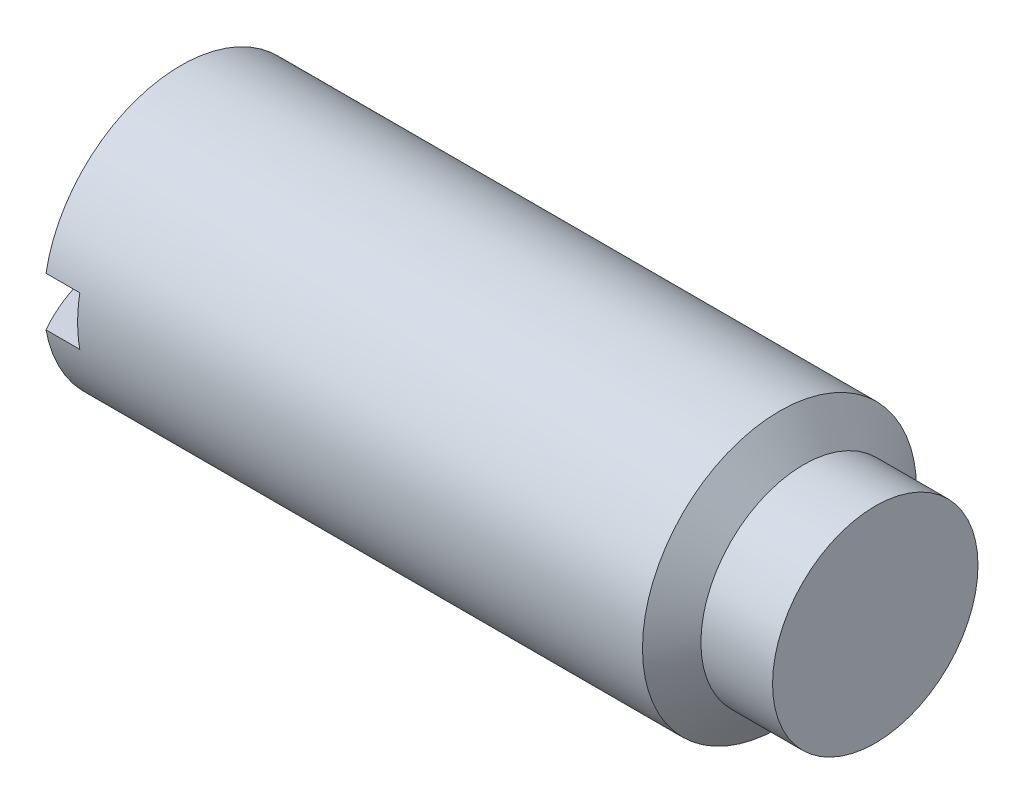
ISO-10303-21;
HEADER;
FILE_DESCRIPTION(('STEP AP214'),'2;1');
FILE_NAME('part.step','',(''),(''),'','','');
FILE_SCHEMA(('AUTOMOTIVE_DESIGN { 1 0 10303 214 1 1 1 1 }'));
ENDSEC;
DATA;
#1=APPLICATION_CONTEXT('core data for automotive mechanical design processes');
#2=APPLICATION_PROTOCOL_DEFINITION('international standard','automotive_design',2000,#1);
#3=PRODUCT_CONTEXT('',#1,'mechanical');
#4=PRODUCT('Part','Part','',(#3));
#5=PRODUCT_RELATED_PRODUCT_CATEGORY('part','',(#4));
#6=PRODUCT_DEFINITION_FORMATION('','',#4);
#7=PRODUCT_DEFINITION_CONTEXT('part definition',#1,'design');
#8=PRODUCT_DEFINITION('design','',#6,#7);
#9=PRODUCT_DEFINITION_SHAPE('','',#8);
#10=(LENGTH_UNIT() NAMED_UNIT(*) SI_UNIT(.MILLI.,.METRE.));
#11=(NAMED_UNIT(*) PLANE_ANGLE_UNIT() SI_UNIT($,.RADIAN.));
#12=(NAMED_UNIT(*) SI_UNIT($,.STERADIAN.) SOLID_ANGLE_UNIT());
#13=UNCERTAINTY_MEASURE_WITH_UNIT(LENGTH_MEASURE(1.E-05),#10,'distance_accuracy_value','');
#14=(GEOMETRIC_REPRESENTATION_CONTEXT(3) GLOBAL_UNCERTAINTY_ASSIGNED_CONTEXT((#13)) GLOBAL_UNIT_ASSIGNED_CONTEXT((#10,
#11,#12)) REPRESENTATION_CONTEXT('',''));
#15=CARTESIAN_POINT('',(0.,0.,0.));
#16=DIRECTION('',(0.,0.,1.));
#17=DIRECTION('',(1.,0.,0.));
#18=AXIS2_PLACEMENT_3D('',#15,#16,#17);
#19=CARTESIAN_POINT('',(19.05,0.,0.));
#20=DIRECTION('',(-1.,0.,0.));
#21=DIRECTION('',(0.,1.,0.));
#22=AXIS2_PLACEMENT_3D('',#19,#20,#21);
#23=SPHERICAL_SURFACE('',#22,19.05);
#24=CARTESIAN_POINT('',(19.05,1.7018,0.));
#25=DIRECTION('',(0.,-1.,0.));
#26=DIRECTION('',(0.,0.,-1.));
#27=AXIS2_PLACEMENT_3D('',#24,#25,#26);
#28=CIRCLE('',#27,18.9738340026469);
#29=CARTESIAN_POINT('',(2.55221605790645,1.7018,9.37173952689681));
#30=VERTEX_POINT('',#29);
#31=CARTESIAN_POINT('',(2.55221605790645,1.7018,-9.37173952689681));
#32=VERTEX_POINT('',#31);
#33=EDGE_CURVE('E94',#30,#32,#28,.T.);
#34=ORIENTED_EDGE('',*,*,#33,.F.);
#35=CARTESIAN_POINT('',(2.55221605790645,0.,0.));
#36=DIRECTION('',(-1.,0.,0.));
#37=DIRECTION('',(0.,0.,1.));
#38=AXIS2_PLACEMENT_3D('',#35,#36,#37);
#39=CIRCLE('',#38,9.525);
#40=EDGE_CURVE('E85',#30,#32,#39,.T.);
#41=ORIENTED_EDGE('',*,*,#40,.T.);
#42=EDGE_LOOP('',(#34,#41));
#43=FACE_BOUND('',#42,.T.);
#44=ADVANCED_FACE('F32',(#43),#23,.T.);
#45=CARTESIAN_POINT('',(19.05,-1.7018,0.));
#46=DIRECTION('',(0.,1.,0.));
#47=DIRECTION('',(0.,0.,1.));
#48=AXIS2_PLACEMENT_3D('',#45,#46,#47);
#49=CIRCLE('',#48,18.9738340026469);
#50=CARTESIAN_POINT('',(2.55221605790645,-1.7018,-9.37173952689681));
#51=VERTEX_POINT('',#50);
#52=CARTESIAN_POINT('',(2.55221605790645,-1.7018,9.37173952689681));
#53=VERTEX_POINT('',#52);
#54=EDGE_CURVE('E111',#51,#53,#49,.T.);
#55=ORIENTED_EDGE('',*,*,#54,.F.);
#56=EDGE_CURVE('E88',#51,#53,#39,.T.);
#57=ORIENTED_EDGE('',*,*,#56,.T.);
#58=EDGE_LOOP('',(#55,#57));
#59=FACE_BOUND('',#58,.T.);
#60=ADVANCED_FACE('F110',(#59),#23,.T.);
#61=CARTESIAN_POINT('',(-12.7,0.,0.));
#62=DIRECTION('',(-1.,0.,0.));
#63=DIRECTION('',(0.,0.,1.));
#64=AXIS2_PLACEMENT_3D('',#61,#62,#63);
#65=CYLINDRICAL_SURFACE('',#64,9.525);
#66=CARTESIAN_POINT('',(44.1497844817705,0.,0.));
#67=DIRECTION('',(-1.,0.,0.));
#68=DIRECTION('',(0.,0.,1.));
#69=AXIS2_PLACEMENT_3D('',#66,#67,#68);
#70=CIRCLE('',#69,9.525);
#71=CARTESIAN_POINT('',(44.1497844817705,0.,9.525));
#72=VERTEX_POINT('',#71);
#73=EDGE_CURVE('E87',#72,#72,#70,.T.);
#74=ORIENTED_EDGE('',*,*,#73,.T.);
#75=EDGE_LOOP('',(#74));
#76=FACE_BOUND('',#75,.T.);
#77=ORIENTED_EDGE('',*,*,#40,.F.);
#78=DIRECTION('',(-1.,0.,0.));
#79=VECTOR('',#78,1.);
#80=CARTESIAN_POINT('',(-12.7,1.7018,9.37173952689681));
#81=LINE('',#80,#79);
#82=CARTESIAN_POINT('',(4.9022,1.7018,9.37173952689681));
#83=VERTEX_POINT('',#82);
#84=EDGE_CURVE('E11',#30,#83,#81,.F.);
#85=ORIENTED_EDGE('',*,*,#84,.T.);
#86=CARTESIAN_POINT('',(4.9022,0.,0.));
#87=DIRECTION('',(1.,0.,0.));
#88=DIRECTION('',(0.,0.,-1.));
#89=AXIS2_PLACEMENT_3D('',#86,#87,#88);
#90=CIRCLE('',#89,9.525);
#91=CARTESIAN_POINT('',(4.9022,-1.7018,9.37173952689681));
#92=VERTEX_POINT('',#91);
#93=EDGE_CURVE('E68',#92,#83,#90,.F.);
#94=ORIENTED_EDGE('',*,*,#93,.F.);
#95=DIRECTION('',(-1.,0.,0.));
#96=VECTOR('',#95,1.);
#97=CARTESIAN_POINT('',(-12.7,-1.7018,9.37173952689681));
#98=LINE('',#97,#96);
#99=EDGE_CURVE('E39',#92,#53,#98,.T.);
#100=ORIENTED_EDGE('',*,*,#99,.T.);
#101=ORIENTED_EDGE('',*,*,#56,.F.);
#102=DIRECTION('',(-1.,0.,0.));
#103=VECTOR('',#102,1.);
#104=CARTESIAN_POINT('',(-12.7,-1.7018,-9.37173952689681));
#105=LINE('',#104,#103);
#106=CARTESIAN_POINT('',(4.9022,-1.7018,-9.37173952689681));
#107=VERTEX_POINT('',#106);
#108=EDGE_CURVE('E103',#51,#107,#105,.F.);
#109=ORIENTED_EDGE('',*,*,#108,.T.);
#110=CARTESIAN_POINT('',(4.9022,1.7018,-9.37173952689681));
#111=VERTEX_POINT('',#110);
#112=EDGE_CURVE('E77',#111,#107,#90,.F.);
#113=ORIENTED_EDGE('',*,*,#112,.F.);
#114=DIRECTION('',(-1.,0.,0.));
#115=VECTOR('',#114,1.);
#116=CARTESIAN_POINT('',(-12.7,1.7018,-9.37173952689681));
#117=LINE('',#116,#115);
#118=EDGE_CURVE('E75',#111,#32,#117,.T.);
#119=ORIENTED_EDGE('',*,*,#118,.T.);
#120=EDGE_LOOP('',(#77,#85,#94,#100,#101,#109,#113,#119));
#121=FACE_BOUND('',#120,.T.);
#122=ADVANCED_FACE('F83',(#76,#121),#65,.T.);
#123=CARTESIAN_POINT('',(50.8,7.1374,0.));
#124=DIRECTION('',(1.,0.,0.));
#125=DIRECTION('',(0.,0.,-1.));
#126=AXIS2_PLACEMENT_3D('',#123,#124,#125);
#127=PLANE('',#126);
#128=CARTESIAN_POINT('',(50.8,0.,0.));
#129=DIRECTION('',(-1.,0.,0.));
#130=DIRECTION('',(0.,0.,1.));
#131=AXIS2_PLACEMENT_3D('',#128,#129,#130);
#132=CIRCLE('',#131,7.1374);
#133=CARTESIAN_POINT('',(50.8,0.,7.1374));
#134=VERTEX_POINT('',#133);
#135=EDGE_CURVE('E100',#134,#134,#132,.T.);
#136=ORIENTED_EDGE('',*,*,#135,.F.);
#137=EDGE_LOOP('',(#136));
#138=FACE_BOUND('',#137,.T.);
#139=ADVANCED_FACE('F130',(#138),#127,.T.);
#140=CARTESIAN_POINT('',(-12.7,0.,0.));
#141=DIRECTION('',(-1.,0.,0.));
#142=DIRECTION('',(0.,0.,1.));
#143=AXIS2_PLACEMENT_3D('',#140,#141,#142);
#144=CYLINDRICAL_SURFACE('',#143,7.1374);
#145=ORIENTED_EDGE('',*,*,#135,.T.);
#146=EDGE_LOOP('',(#145));
#147=FACE_BOUND('',#146,.T.);
#148=CARTESIAN_POINT('',(45.8216,0.,0.));
#149=DIRECTION('',(-1.,0.,0.));
#150=DIRECTION('',(0.,0.,1.));
#151=AXIS2_PLACEMENT_3D('',#148,#149,#150);
#152=CIRCLE('',#151,7.1374);
#153=CARTESIAN_POINT('',(45.8216,0.,7.1374));
#154=VERTEX_POINT('',#153);
#155=EDGE_CURVE('E91',#154,#154,#152,.T.);
#156=ORIENTED_EDGE('',*,*,#155,.F.);
#157=EDGE_LOOP('',(#156));
#158=FACE_BOUND('',#157,.T.);
#159=ADVANCED_FACE('F136',(#147,#158),#144,.T.);
#160=CARTESIAN_POINT('',(45.8216,0.,0.));
#161=DIRECTION('',(-1.,0.,0.));
#162=DIRECTION('',(0.,0.,1.));
#163=AXIS2_PLACEMENT_3D('',#160,#161,#162);
#164=CONICAL_SURFACE('',#163,7.1374,0.959931088596876);
#165=ORIENTED_EDGE('',*,*,#73,.F.);
#166=EDGE_LOOP('',(#165));
#167=FACE_BOUND('',#166,.T.);
#168=ORIENTED_EDGE('',*,*,#155,.T.);
#169=EDGE_LOOP('',(#168));
#170=FACE_BOUND('',#169,.T.);
#171=ADVANCED_FACE('F121',(#167,#170),#164,.T.);
#172=CARTESIAN_POINT('',(4.9022,1.7018,-9.52499999999999));
#173=DIRECTION('',(0.,-1.,0.));
#174=DIRECTION('',(0.,0.,-1.));
#175=AXIS2_PLACEMENT_3D('',#172,#173,#174);
#176=PLANE('',#175);
#177=ORIENTED_EDGE('',*,*,#33,.T.);
#178=ORIENTED_EDGE('',*,*,#118,.F.);
#179=DIRECTION('',(0.,0.,1.));
#180=VECTOR('',#179,1.);
#181=CARTESIAN_POINT('',(4.9022,1.7018,-9.52499999999999));
#182=LINE('',#181,#180);
#183=EDGE_CURVE('E46',#111,#83,#182,.T.);
#184=ORIENTED_EDGE('',*,*,#183,.T.);
#185=ORIENTED_EDGE('',*,*,#84,.F.);
#186=EDGE_LOOP('',(#177,#178,#184,#185));
#187=FACE_BOUND('',#186,.T.);
#188=ADVANCED_FACE('F78',(#187),#176,.T.);
#189=CARTESIAN_POINT('',(4.9022,-1.7018,-9.52499999999999));
#190=DIRECTION('',(0.,1.,0.));
#191=DIRECTION('',(0.,0.,1.));
#192=AXIS2_PLACEMENT_3D('',#189,#190,#191);
#193=PLANE('',#192);
#194=ORIENTED_EDGE('',*,*,#54,.T.);
#195=ORIENTED_EDGE('',*,*,#99,.F.);
#196=DIRECTION('',(0.,0.,-1.));
#197=VECTOR('',#196,1.);
#198=CARTESIAN_POINT('',(4.9022,-1.7018,-9.52499999999999));
#199=LINE('',#198,#197);
#200=EDGE_CURVE('E71',#92,#107,#199,.T.);
#201=ORIENTED_EDGE('',*,*,#200,.T.);
#202=ORIENTED_EDGE('',*,*,#108,.F.);
#203=EDGE_LOOP('',(#194,#195,#201,#202));
#204=FACE_BOUND('',#203,.T.);
#205=ADVANCED_FACE('F113',(#204),#193,.T.);
#206=CARTESIAN_POINT('',(4.9022,1.7018,-9.52499999999999));
#207=DIRECTION('',(1.,0.,0.));
#208=DIRECTION('',(0.,0.,-1.));
#209=AXIS2_PLACEMENT_3D('',#206,#207,#208);
#210=PLANE('',#209);
#211=ORIENTED_EDGE('',*,*,#200,.F.);
#212=ORIENTED_EDGE('',*,*,#93,.T.);
#213=ORIENTED_EDGE('',*,*,#183,.F.);
#214=ORIENTED_EDGE('',*,*,#112,.T.);
#215=EDGE_LOOP('',(#211,#212,#213,#214));
#216=FACE_BOUND('',#215,.T.);
#217=ADVANCED_FACE('F69',(#216),#210,.F.);
#218=CLOSED_SHELL('',(#44,#60,#122,#139,#159,#171,#188,#205,#217));
#219=MANIFOLD_SOLID_BREP('B2',#218);
#220=ADVANCED_BREP_SHAPE_REPRESENTATION('',(#18,#219),#14);
#221=SHAPE_DEFINITION_REPRESENTATION(#9,#220);
ENDSEC;
END-ISO-10303-21;
